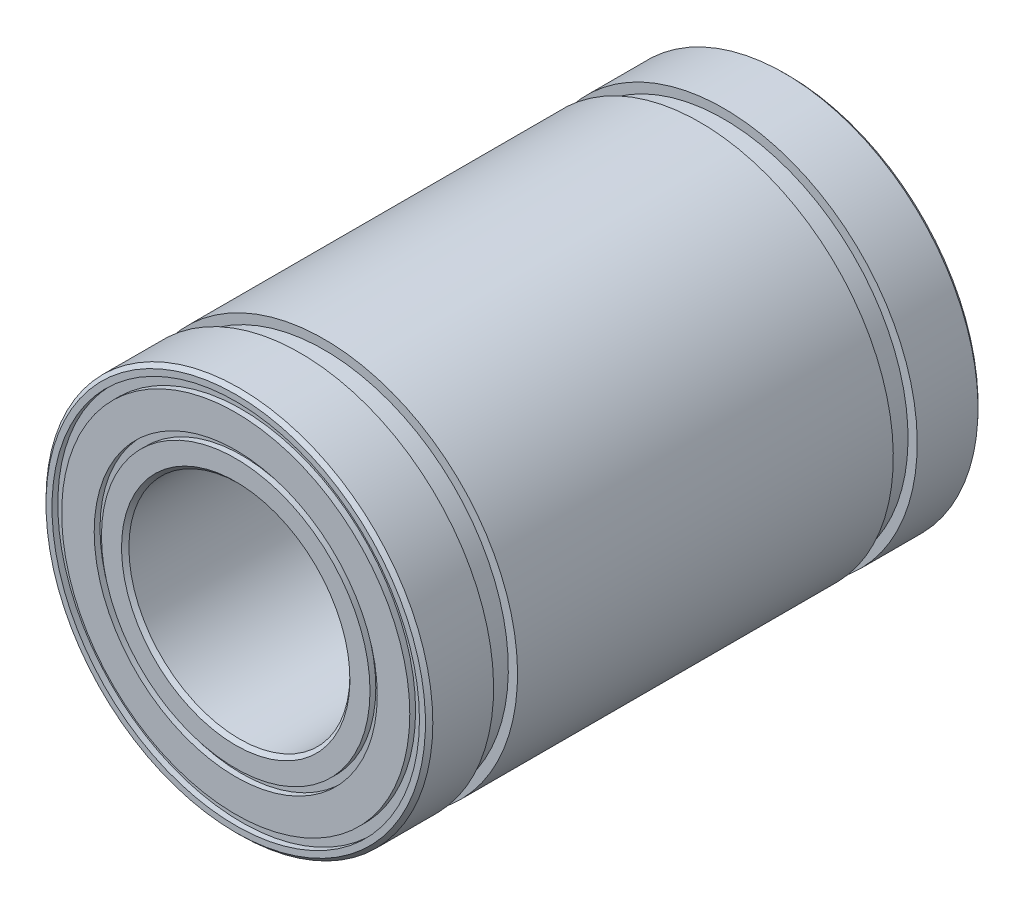
ISO-10303-21;
HEADER;
FILE_DESCRIPTION(('STEP AP214'),'2;1');
FILE_NAME('part.step','',(''),(''),'','','');
FILE_SCHEMA(('AUTOMOTIVE_DESIGN { 1 0 10303 214 1 1 1 1 }'));
ENDSEC;
DATA;
#1=APPLICATION_CONTEXT('core data for automotive mechanical design processes');
#2=APPLICATION_PROTOCOL_DEFINITION('international standard','automotive_design',2000,#1);
#3=PRODUCT_CONTEXT('',#1,'mechanical');
#4=PRODUCT('Part','Part','',(#3));
#5=PRODUCT_RELATED_PRODUCT_CATEGORY('part','',(#4));
#6=PRODUCT_DEFINITION_FORMATION('','',#4);
#7=PRODUCT_DEFINITION_CONTEXT('part definition',#1,'design');
#8=PRODUCT_DEFINITION('design','',#6,#7);
#9=PRODUCT_DEFINITION_SHAPE('','',#8);
#10=(LENGTH_UNIT() NAMED_UNIT(*) SI_UNIT(.MILLI.,.METRE.));
#11=(NAMED_UNIT(*) PLANE_ANGLE_UNIT() SI_UNIT($,.RADIAN.));
#12=(NAMED_UNIT(*) SI_UNIT($,.STERADIAN.) SOLID_ANGLE_UNIT());
#13=UNCERTAINTY_MEASURE_WITH_UNIT(LENGTH_MEASURE(1.E-05),#10,'distance_accuracy_value','');
#14=(GEOMETRIC_REPRESENTATION_CONTEXT(3) GLOBAL_UNCERTAINTY_ASSIGNED_CONTEXT((#13)) GLOBAL_UNIT_ASSIGNED_CONTEXT((#10,
#11,#12)) REPRESENTATION_CONTEXT('',''));
#15=CARTESIAN_POINT('',(0.,0.,0.));
#16=DIRECTION('',(0.,0.,1.));
#17=DIRECTION('',(1.,0.,0.));
#18=AXIS2_PLACEMENT_3D('',#15,#16,#17);
#19=CARTESIAN_POINT('',(0.,0.,15.));
#20=DIRECTION('',(0.,0.,-1.));
#21=DIRECTION('',(0.,1.,0.));
#22=AXIS2_PLACEMENT_3D('',#19,#20,#21);
#23=CYLINDRICAL_SURFACE('',#22,6.);
#24=CARTESIAN_POINT('',(0.,0.,14.7999999999797));
#25=DIRECTION('',(0.,0.,1.));
#26=DIRECTION('',(1.,0.,0.));
#27=AXIS2_PLACEMENT_3D('',#24,#25,#26);
#28=CIRCLE('',#27,6.00000000002865);
#29=CARTESIAN_POINT('',(6.00000000002865,0.,14.7999999999797));
#30=VERTEX_POINT('',#29);
#31=EDGE_CURVE('E30',#30,#30,#28,.T.);
#32=ORIENTED_EDGE('',*,*,#31,.T.);
#33=EDGE_LOOP('',(#32));
#34=FACE_BOUND('',#33,.T.);
#35=CARTESIAN_POINT('',(0.,0.,-14.8000000000366));
#36=DIRECTION('',(0.,0.,-1.));
#37=DIRECTION('',(1.,0.,0.));
#38=AXIS2_PLACEMENT_3D('',#35,#36,#37);
#39=CIRCLE('',#38,5.99999999997181);
#40=CARTESIAN_POINT('',(5.99999999997181,0.,-14.8000000000366));
#41=VERTEX_POINT('',#40);
#42=EDGE_CURVE('E110',#41,#41,#39,.T.);
#43=ORIENTED_EDGE('',*,*,#42,.T.);
#44=EDGE_LOOP('',(#43));
#45=FACE_BOUND('',#44,.T.);
#46=ADVANCED_FACE('F15',(#34,#45),#23,.F.);
#47=CARTESIAN_POINT('',(0.,0.,15.0000000000432));
#48=DIRECTION('',(0.,0.,1.));
#49=DIRECTION('',(0.,-1.,0.));
#50=AXIS2_PLACEMENT_3D('',#47,#48,#49);
#51=CONICAL_SURFACE('',#50,6.20000000009213,0.785398163397448);
#52=ORIENTED_EDGE('',*,*,#31,.F.);
#53=EDGE_LOOP('',(#52));
#54=FACE_BOUND('',#53,.T.);
#55=CARTESIAN_POINT('',(0.,0.,15.0000000000432));
#56=DIRECTION('',(0.,0.,1.));
#57=DIRECTION('',(0.,-1.,0.));
#58=AXIS2_PLACEMENT_3D('',#55,#56,#57);
#59=CIRCLE('',#58,6.20000000009213);
#60=CARTESIAN_POINT('',(0.,-6.20000000009213,15.0000000000432));
#61=VERTEX_POINT('',#60);
#62=EDGE_CURVE('E18',#61,#61,#59,.T.);
#63=ORIENTED_EDGE('',*,*,#62,.T.);
#64=EDGE_LOOP('',(#63));
#65=FACE_BOUND('',#64,.T.);
#66=ADVANCED_FACE('F429',(#54,#65),#51,.F.);
#67=CARTESIAN_POINT('',(0.,0.,-14.9999999999864));
#68=DIRECTION('',(0.,0.,-1.));
#69=DIRECTION('',(-1.,0.,0.));
#70=AXIS2_PLACEMENT_3D('',#67,#68,#69);
#71=CONICAL_SURFACE('',#70,6.1999999999216,0.78539816325534);
#72=CARTESIAN_POINT('',(0.,0.,-15.0000000000432));
#73=DIRECTION('',(0.,0.,-1.));
#74=DIRECTION('',(-1.,0.,0.));
#75=AXIS2_PLACEMENT_3D('',#72,#73,#74);
#76=CIRCLE('',#75,6.19999999997844);
#77=CARTESIAN_POINT('',(-6.19999999997844,0.,-15.0000000000432));
#78=VERTEX_POINT('',#77);
#79=EDGE_CURVE('E105',#78,#78,#76,.T.);
#80=ORIENTED_EDGE('',*,*,#79,.T.);
#81=EDGE_LOOP('',(#80));
#82=FACE_BOUND('',#81,.T.);
#83=ORIENTED_EDGE('',*,*,#42,.F.);
#84=EDGE_LOOP('',(#83));
#85=FACE_BOUND('',#84,.T.);
#86=ADVANCED_FACE('F420',(#82,#85),#71,.F.);
#87=CARTESIAN_POINT('',(0.,6.44999999999999,15.));
#88=DIRECTION('',(0.,0.,-1.));
#89=DIRECTION('',(0.,1.,0.));
#90=AXIS2_PLACEMENT_3D('',#87,#88,#89);
#91=PLANE('',#90);
#92=ORIENTED_EDGE('',*,*,#62,.F.);
#93=EDGE_LOOP('',(#92));
#94=FACE_BOUND('',#93,.T.);
#95=CARTESIAN_POINT('',(0.,0.,15.));
#96=DIRECTION('',(0.,0.,1.));
#97=DIRECTION('',(1.,0.,0.));
#98=AXIS2_PLACEMENT_3D('',#95,#96,#97);
#99=CIRCLE('',#98,7.29);
#100=CARTESIAN_POINT('',(7.29,0.,15.));
#101=VERTEX_POINT('',#100);
#102=EDGE_CURVE('E103',#101,#101,#99,.F.);
#103=ORIENTED_EDGE('',*,*,#102,.F.);
#104=EDGE_LOOP('',(#103));
#105=FACE_BOUND('',#104,.T.);
#106=ADVANCED_FACE('F411',(#94,#105),#91,.F.);
#107=CARTESIAN_POINT('',(0.,10.5,-15.));
#108=DIRECTION('',(0.,0.,1.));
#109=DIRECTION('',(0.,-1.,0.));
#110=AXIS2_PLACEMENT_3D('',#107,#108,#109);
#111=PLANE('',#110);
#112=ORIENTED_EDGE('',*,*,#79,.F.);
#113=EDGE_LOOP('',(#112));
#114=FACE_BOUND('',#113,.T.);
#115=CARTESIAN_POINT('',(0.,0.,-15.));
#116=DIRECTION('',(0.,0.,-1.));
#117=DIRECTION('',(-1.,0.,0.));
#118=AXIS2_PLACEMENT_3D('',#115,#116,#117);
#119=CIRCLE('',#118,7.29);
#120=CARTESIAN_POINT('',(-7.29,0.,-15.));
#121=VERTEX_POINT('',#120);
#122=EDGE_CURVE('E100',#121,#121,#119,.F.);
#123=ORIENTED_EDGE('',*,*,#122,.F.);
#124=EDGE_LOOP('',(#123));
#125=FACE_BOUND('',#124,.T.);
#126=ADVANCED_FACE('F402',(#114,#125),#111,.F.);
#127=CARTESIAN_POINT('',(0.,0.,14.685));
#128=DIRECTION('',(0.,0.,1.));
#129=DIRECTION('',(1.,0.,0.));
#130=AXIS2_PLACEMENT_3D('',#127,#128,#129);
#131=CYLINDRICAL_SURFACE('',#130,7.29);
#132=CARTESIAN_POINT('',(0.,0.,14.685));
#133=DIRECTION('',(0.,0.,1.));
#134=DIRECTION('',(1.,0.,0.));
#135=AXIS2_PLACEMENT_3D('',#132,#133,#134);
#136=CIRCLE('',#135,7.29);
#137=CARTESIAN_POINT('',(7.29,0.,14.685));
#138=VERTEX_POINT('',#137);
#139=EDGE_CURVE('E97',#138,#138,#136,.F.);
#140=ORIENTED_EDGE('',*,*,#139,.F.);
#141=EDGE_LOOP('',(#140));
#142=FACE_BOUND('',#141,.T.);
#143=ORIENTED_EDGE('',*,*,#102,.T.);
#144=EDGE_LOOP('',(#143));
#145=FACE_BOUND('',#144,.T.);
#146=ADVANCED_FACE('F393',(#142,#145),#131,.T.);
#147=CARTESIAN_POINT('',(0.,0.,-14.685));
#148=DIRECTION('',(0.,0.,-1.));
#149=DIRECTION('',(-1.,0.,0.));
#150=AXIS2_PLACEMENT_3D('',#147,#148,#149);
#151=CYLINDRICAL_SURFACE('',#150,7.29);
#152=CARTESIAN_POINT('',(0.,0.,-14.685));
#153=DIRECTION('',(0.,0.,-1.));
#154=DIRECTION('',(-1.,0.,0.));
#155=AXIS2_PLACEMENT_3D('',#152,#153,#154);
#156=CIRCLE('',#155,7.29);
#157=CARTESIAN_POINT('',(-7.29,0.,-14.685));
#158=VERTEX_POINT('',#157);
#159=EDGE_CURVE('E94',#158,#158,#156,.F.);
#160=ORIENTED_EDGE('',*,*,#159,.F.);
#161=EDGE_LOOP('',(#160));
#162=FACE_BOUND('',#161,.T.);
#163=ORIENTED_EDGE('',*,*,#122,.T.);
#164=EDGE_LOOP('',(#163));
#165=FACE_BOUND('',#164,.T.);
#166=ADVANCED_FACE('F383',(#162,#165),#151,.T.);
#167=CARTESIAN_POINT('',(0.,0.,14.685));
#168=DIRECTION('',(0.,0.,1.));
#169=DIRECTION('',(1.,0.,0.));
#170=AXIS2_PLACEMENT_3D('',#167,#168,#169);
#171=PLANE('',#170);
#172=ORIENTED_EDGE('',*,*,#139,.T.);
#173=EDGE_LOOP('',(#172));
#174=FACE_BOUND('',#173,.T.);
#175=CARTESIAN_POINT('',(0.,0.,14.685));
#176=DIRECTION('',(0.,0.,1.));
#177=DIRECTION('',(1.,0.,0.));
#178=AXIS2_PLACEMENT_3D('',#175,#176,#177);
#179=CIRCLE('',#178,7.68375);
#180=CARTESIAN_POINT('',(7.68375,0.,14.685));
#181=VERTEX_POINT('',#180);
#182=EDGE_CURVE('E91',#181,#181,#179,.T.);
#183=ORIENTED_EDGE('',*,*,#182,.T.);
#184=EDGE_LOOP('',(#183));
#185=FACE_BOUND('',#184,.T.);
#186=ADVANCED_FACE('F373',(#174,#185),#171,.T.);
#187=CARTESIAN_POINT('',(0.,0.,-14.685));
#188=DIRECTION('',(0.,0.,-1.));
#189=DIRECTION('',(-1.,0.,0.));
#190=AXIS2_PLACEMENT_3D('',#187,#188,#189);
#191=PLANE('',#190);
#192=ORIENTED_EDGE('',*,*,#159,.T.);
#193=EDGE_LOOP('',(#192));
#194=FACE_BOUND('',#193,.T.);
#195=CARTESIAN_POINT('',(0.,0.,-14.685));
#196=DIRECTION('',(0.,0.,-1.));
#197=DIRECTION('',(-1.,0.,0.));
#198=AXIS2_PLACEMENT_3D('',#195,#196,#197);
#199=CIRCLE('',#198,7.68375);
#200=CARTESIAN_POINT('',(-7.68375,0.,-14.685));
#201=VERTEX_POINT('',#200);
#202=EDGE_CURVE('E88',#201,#201,#199,.T.);
#203=ORIENTED_EDGE('',*,*,#202,.T.);
#204=EDGE_LOOP('',(#203));
#205=FACE_BOUND('',#204,.T.);
#206=ADVANCED_FACE('F363',(#194,#205),#191,.T.);
#207=CARTESIAN_POINT('',(0.,0.,14.685));
#208=DIRECTION('',(0.,0.,1.));
#209=DIRECTION('',(1.,0.,0.));
#210=AXIS2_PLACEMENT_3D('',#207,#208,#209);
#211=CYLINDRICAL_SURFACE('',#210,7.68375);
#212=CARTESIAN_POINT('',(0.,0.,15.));
#213=DIRECTION('',(0.,0.,1.));
#214=DIRECTION('',(1.,0.,0.));
#215=AXIS2_PLACEMENT_3D('',#212,#213,#214);
#216=CIRCLE('',#215,7.68375);
#217=CARTESIAN_POINT('',(7.68375,0.,15.));
#218=VERTEX_POINT('',#217);
#219=EDGE_CURVE('E85',#218,#218,#216,.T.);
#220=ORIENTED_EDGE('',*,*,#219,.T.);
#221=EDGE_LOOP('',(#220));
#222=FACE_BOUND('',#221,.T.);
#223=ORIENTED_EDGE('',*,*,#182,.F.);
#224=EDGE_LOOP('',(#223));
#225=FACE_BOUND('',#224,.T.);
#226=ADVANCED_FACE('F353',(#222,#225),#211,.F.);
#227=CARTESIAN_POINT('',(0.,0.,-14.685));
#228=DIRECTION('',(0.,0.,-1.));
#229=DIRECTION('',(-1.,0.,0.));
#230=AXIS2_PLACEMENT_3D('',#227,#228,#229);
#231=CYLINDRICAL_SURFACE('',#230,7.68375);
#232=CARTESIAN_POINT('',(0.,0.,-15.));
#233=DIRECTION('',(0.,0.,-1.));
#234=DIRECTION('',(-1.,0.,0.));
#235=AXIS2_PLACEMENT_3D('',#232,#233,#234);
#236=CIRCLE('',#235,7.68375);
#237=CARTESIAN_POINT('',(-7.68375,0.,-15.));
#238=VERTEX_POINT('',#237);
#239=EDGE_CURVE('E82',#238,#238,#236,.T.);
#240=ORIENTED_EDGE('',*,*,#239,.T.);
#241=EDGE_LOOP('',(#240));
#242=FACE_BOUND('',#241,.T.);
#243=ORIENTED_EDGE('',*,*,#202,.F.);
#244=EDGE_LOOP('',(#243));
#245=FACE_BOUND('',#244,.T.);
#246=ADVANCED_FACE('F343',(#242,#245),#231,.F.);
#247=CARTESIAN_POINT('',(0.,6.44999999999999,15.));
#248=DIRECTION('',(0.,0.,-1.));
#249=DIRECTION('',(0.,1.,0.));
#250=AXIS2_PLACEMENT_3D('',#247,#248,#249);
#251=PLANE('',#250);
#252=ORIENTED_EDGE('',*,*,#219,.F.);
#253=EDGE_LOOP('',(#252));
#254=FACE_BOUND('',#253,.T.);
#255=CARTESIAN_POINT('',(0.,0.,15.));
#256=DIRECTION('',(0.,0.,1.));
#257=DIRECTION('',(1.,0.,0.));
#258=AXIS2_PLACEMENT_3D('',#255,#256,#257);
#259=CIRCLE('',#258,9.45);
#260=CARTESIAN_POINT('',(9.45,0.,15.));
#261=VERTEX_POINT('',#260);
#262=EDGE_CURVE('E79',#261,#261,#259,.F.);
#263=ORIENTED_EDGE('',*,*,#262,.F.);
#264=EDGE_LOOP('',(#263));
#265=FACE_BOUND('',#264,.T.);
#266=ADVANCED_FACE('F333',(#254,#265),#251,.F.);
#267=CARTESIAN_POINT('',(0.,10.5,-15.));
#268=DIRECTION('',(0.,0.,1.));
#269=DIRECTION('',(0.,-1.,0.));
#270=AXIS2_PLACEMENT_3D('',#267,#268,#269);
#271=PLANE('',#270);
#272=ORIENTED_EDGE('',*,*,#239,.F.);
#273=EDGE_LOOP('',(#272));
#274=FACE_BOUND('',#273,.T.);
#275=CARTESIAN_POINT('',(0.,0.,-15.));
#276=DIRECTION('',(0.,0.,-1.));
#277=DIRECTION('',(-1.,0.,0.));
#278=AXIS2_PLACEMENT_3D('',#275,#276,#277);
#279=CIRCLE('',#278,9.45);
#280=CARTESIAN_POINT('',(-9.45,0.,-15.));
#281=VERTEX_POINT('',#280);
#282=EDGE_CURVE('E76',#281,#281,#279,.F.);
#283=ORIENTED_EDGE('',*,*,#282,.F.);
#284=EDGE_LOOP('',(#283));
#285=FACE_BOUND('',#284,.T.);
#286=ADVANCED_FACE('F323',(#274,#285),#271,.F.);
#287=CARTESIAN_POINT('',(0.,0.,14.685));
#288=DIRECTION('',(0.,0.,1.));
#289=DIRECTION('',(1.,0.,0.));
#290=AXIS2_PLACEMENT_3D('',#287,#288,#289);
#291=CYLINDRICAL_SURFACE('',#290,9.45);
#292=CARTESIAN_POINT('',(0.,0.,14.685));
#293=DIRECTION('',(0.,0.,1.));
#294=DIRECTION('',(1.,0.,0.));
#295=AXIS2_PLACEMENT_3D('',#292,#293,#294);
#296=CIRCLE('',#295,9.45);
#297=CARTESIAN_POINT('',(9.45,0.,14.685));
#298=VERTEX_POINT('',#297);
#299=EDGE_CURVE('E73',#298,#298,#296,.F.);
#300=ORIENTED_EDGE('',*,*,#299,.F.);
#301=EDGE_LOOP('',(#300));
#302=FACE_BOUND('',#301,.T.);
#303=ORIENTED_EDGE('',*,*,#262,.T.);
#304=EDGE_LOOP('',(#303));
#305=FACE_BOUND('',#304,.T.);
#306=ADVANCED_FACE('F313',(#302,#305),#291,.T.);
#307=CARTESIAN_POINT('',(0.,0.,-14.685));
#308=DIRECTION('',(0.,0.,-1.));
#309=DIRECTION('',(-1.,0.,0.));
#310=AXIS2_PLACEMENT_3D('',#307,#308,#309);
#311=CYLINDRICAL_SURFACE('',#310,9.45);
#312=CARTESIAN_POINT('',(0.,0.,-14.685));
#313=DIRECTION('',(0.,0.,-1.));
#314=DIRECTION('',(-1.,0.,0.));
#315=AXIS2_PLACEMENT_3D('',#312,#313,#314);
#316=CIRCLE('',#315,9.45);
#317=CARTESIAN_POINT('',(-9.45,0.,-14.685));
#318=VERTEX_POINT('',#317);
#319=EDGE_CURVE('E70',#318,#318,#316,.F.);
#320=ORIENTED_EDGE('',*,*,#319,.F.);
#321=EDGE_LOOP('',(#320));
#322=FACE_BOUND('',#321,.T.);
#323=ORIENTED_EDGE('',*,*,#282,.T.);
#324=EDGE_LOOP('',(#323));
#325=FACE_BOUND('',#324,.T.);
#326=ADVANCED_FACE('F303',(#322,#325),#311,.T.);
#327=CARTESIAN_POINT('',(0.,0.,14.685));
#328=DIRECTION('',(0.,0.,1.));
#329=DIRECTION('',(1.,0.,0.));
#330=AXIS2_PLACEMENT_3D('',#327,#328,#329);
#331=PLANE('',#330);
#332=ORIENTED_EDGE('',*,*,#299,.T.);
#333=EDGE_LOOP('',(#332));
#334=FACE_BOUND('',#333,.T.);
#335=CARTESIAN_POINT('',(0.,0.,14.685));
#336=DIRECTION('',(0.,0.,1.));
#337=DIRECTION('',(1.,0.,0.));
#338=AXIS2_PLACEMENT_3D('',#335,#336,#337);
#339=CIRCLE('',#338,9.975);
#340=CARTESIAN_POINT('',(9.975,0.,14.685));
#341=VERTEX_POINT('',#340);
#342=EDGE_CURVE('E67',#341,#341,#339,.T.);
#343=ORIENTED_EDGE('',*,*,#342,.T.);
#344=EDGE_LOOP('',(#343));
#345=FACE_BOUND('',#344,.T.);
#346=ADVANCED_FACE('F294',(#334,#345),#331,.T.);
#347=CARTESIAN_POINT('',(0.,0.,-14.685));
#348=DIRECTION('',(0.,0.,-1.));
#349=DIRECTION('',(-1.,0.,0.));
#350=AXIS2_PLACEMENT_3D('',#347,#348,#349);
#351=PLANE('',#350);
#352=ORIENTED_EDGE('',*,*,#319,.T.);
#353=EDGE_LOOP('',(#352));
#354=FACE_BOUND('',#353,.T.);
#355=CARTESIAN_POINT('',(0.,0.,-14.685));
#356=DIRECTION('',(0.,0.,-1.));
#357=DIRECTION('',(-1.,0.,0.));
#358=AXIS2_PLACEMENT_3D('',#355,#356,#357);
#359=CIRCLE('',#358,9.975);
#360=CARTESIAN_POINT('',(-9.975,0.,-14.685));
#361=VERTEX_POINT('',#360);
#362=EDGE_CURVE('E64',#361,#361,#359,.T.);
#363=ORIENTED_EDGE('',*,*,#362,.T.);
#364=EDGE_LOOP('',(#363));
#365=FACE_BOUND('',#364,.T.);
#366=ADVANCED_FACE('F285',(#354,#365),#351,.T.);
#367=CARTESIAN_POINT('',(0.,0.,14.685));
#368=DIRECTION('',(0.,0.,1.));
#369=DIRECTION('',(1.,0.,0.));
#370=AXIS2_PLACEMENT_3D('',#367,#368,#369);
#371=CYLINDRICAL_SURFACE('',#370,9.975);
#372=CARTESIAN_POINT('',(0.,0.,15.));
#373=DIRECTION('',(0.,0.,1.));
#374=DIRECTION('',(1.,0.,0.));
#375=AXIS2_PLACEMENT_3D('',#372,#373,#374);
#376=CIRCLE('',#375,9.975);
#377=CARTESIAN_POINT('',(9.975,0.,15.));
#378=VERTEX_POINT('',#377);
#379=EDGE_CURVE('E61',#378,#378,#376,.T.);
#380=ORIENTED_EDGE('',*,*,#379,.T.);
#381=EDGE_LOOP('',(#380));
#382=FACE_BOUND('',#381,.T.);
#383=ORIENTED_EDGE('',*,*,#342,.F.);
#384=EDGE_LOOP('',(#383));
#385=FACE_BOUND('',#384,.T.);
#386=ADVANCED_FACE('F276',(#382,#385),#371,.F.);
#387=CARTESIAN_POINT('',(0.,0.,-14.685));
#388=DIRECTION('',(0.,0.,-1.));
#389=DIRECTION('',(-1.,0.,0.));
#390=AXIS2_PLACEMENT_3D('',#387,#388,#389);
#391=CYLINDRICAL_SURFACE('',#390,9.975);
#392=CARTESIAN_POINT('',(0.,0.,-15.));
#393=DIRECTION('',(0.,0.,-1.));
#394=DIRECTION('',(-1.,0.,0.));
#395=AXIS2_PLACEMENT_3D('',#392,#393,#394);
#396=CIRCLE('',#395,9.975);
#397=CARTESIAN_POINT('',(-9.975,0.,-15.));
#398=VERTEX_POINT('',#397);
#399=EDGE_CURVE('E58',#398,#398,#396,.T.);
#400=ORIENTED_EDGE('',*,*,#399,.T.);
#401=EDGE_LOOP('',(#400));
#402=FACE_BOUND('',#401,.T.);
#403=ORIENTED_EDGE('',*,*,#362,.F.);
#404=EDGE_LOOP('',(#403));
#405=FACE_BOUND('',#404,.T.);
#406=ADVANCED_FACE('F267',(#402,#405),#391,.F.);
#407=CARTESIAN_POINT('',(0.,6.44999999999999,15.));
#408=DIRECTION('',(0.,0.,-1.));
#409=DIRECTION('',(0.,1.,0.));
#410=AXIS2_PLACEMENT_3D('',#407,#408,#409);
#411=PLANE('',#410);
#412=ORIENTED_EDGE('',*,*,#379,.F.);
#413=EDGE_LOOP('',(#412));
#414=FACE_BOUND('',#413,.T.);
#415=CARTESIAN_POINT('',(0.,0.,15.));
#416=DIRECTION('',(0.,0.,-1.));
#417=DIRECTION('',(0.,1.,0.));
#418=AXIS2_PLACEMENT_3D('',#415,#416,#417);
#419=CIRCLE('',#418,10.3);
#420=CARTESIAN_POINT('',(0.,10.3,15.));
#421=VERTEX_POINT('',#420);
#422=EDGE_CURVE('E55',#421,#421,#419,.T.);
#423=ORIENTED_EDGE('',*,*,#422,.F.);
#424=EDGE_LOOP('',(#423));
#425=FACE_BOUND('',#424,.T.);
#426=ADVANCED_FACE('F258',(#414,#425),#411,.F.);
#427=CARTESIAN_POINT('',(0.,10.5,-15.));
#428=DIRECTION('',(0.,0.,1.));
#429=DIRECTION('',(0.,-1.,0.));
#430=AXIS2_PLACEMENT_3D('',#427,#428,#429);
#431=PLANE('',#430);
#432=ORIENTED_EDGE('',*,*,#399,.F.);
#433=EDGE_LOOP('',(#432));
#434=FACE_BOUND('',#433,.T.);
#435=CARTESIAN_POINT('',(0.,0.,-15.));
#436=DIRECTION('',(0.,0.,1.));
#437=DIRECTION('',(0.,-1.,0.));
#438=AXIS2_PLACEMENT_3D('',#435,#436,#437);
#439=CIRCLE('',#438,10.3);
#440=CARTESIAN_POINT('',(0.,-10.3,-15.));
#441=VERTEX_POINT('',#440);
#442=EDGE_CURVE('E51',#441,#441,#439,.T.);
#443=ORIENTED_EDGE('',*,*,#442,.F.);
#444=EDGE_LOOP('',(#443));
#445=FACE_BOUND('',#444,.T.);
#446=ADVANCED_FACE('F143',(#434,#445),#431,.F.);
#447=CARTESIAN_POINT('',(0.,0.,14.8));
#448=DIRECTION('',(0.,0.,-1.));
#449=DIRECTION('',(0.,1.,0.));
#450=AXIS2_PLACEMENT_3D('',#447,#448,#449);
#451=CONICAL_SURFACE('',#450,10.5,0.785398163397453);
#452=CARTESIAN_POINT('',(0.,0.,14.8));
#453=DIRECTION('',(0.,0.,1.));
#454=DIRECTION('',(0.,-1.,0.));
#455=AXIS2_PLACEMENT_3D('',#452,#453,#454);
#456=CIRCLE('',#455,10.5);
#457=CARTESIAN_POINT('',(0.,-10.5,14.8));
#458=VERTEX_POINT('',#457);
#459=EDGE_CURVE('E54',#458,#458,#456,.F.);
#460=ORIENTED_EDGE('',*,*,#459,.F.);
#461=EDGE_LOOP('',(#460));
#462=FACE_BOUND('',#461,.T.);
#463=ORIENTED_EDGE('',*,*,#422,.T.);
#464=EDGE_LOOP('',(#463));
#465=FACE_BOUND('',#464,.T.);
#466=ADVANCED_FACE('F133',(#462,#465),#451,.T.);
#467=CARTESIAN_POINT('',(0.,0.,-14.8));
#468=DIRECTION('',(0.,0.,1.));
#469=DIRECTION('',(0.,-1.,0.));
#470=AXIS2_PLACEMENT_3D('',#467,#468,#469);
#471=CONICAL_SURFACE('',#470,10.5,0.785398163397435);
#472=ORIENTED_EDGE('',*,*,#442,.T.);
#473=EDGE_LOOP('',(#472));
#474=FACE_BOUND('',#473,.T.);
#475=CARTESIAN_POINT('',(0.,0.,-14.8));
#476=DIRECTION('',(0.,0.,1.));
#477=DIRECTION('',(0.,-1.,0.));
#478=AXIS2_PLACEMENT_3D('',#475,#476,#477);
#479=CIRCLE('',#478,10.5);
#480=CARTESIAN_POINT('',(0.,-10.5,-14.8));
#481=VERTEX_POINT('',#480);
#482=EDGE_CURVE('E50',#481,#481,#479,.T.);
#483=ORIENTED_EDGE('',*,*,#482,.F.);
#484=EDGE_LOOP('',(#483));
#485=FACE_BOUND('',#484,.T.);
#486=ADVANCED_FACE('F130',(#474,#485),#471,.T.);
#487=CARTESIAN_POINT('',(0.,0.,15.));
#488=DIRECTION('',(0.,0.,1.));
#489=DIRECTION('',(0.,-1.,0.));
#490=AXIS2_PLACEMENT_3D('',#487,#488,#489);
#491=CYLINDRICAL_SURFACE('',#490,10.5);
#492=CARTESIAN_POINT('',(0.,0.,11.5));
#493=DIRECTION('',(0.,0.,1.));
#494=DIRECTION('',(0.,-1.,0.));
#495=AXIS2_PLACEMENT_3D('',#492,#493,#494);
#496=CIRCLE('',#495,10.5);
#497=CARTESIAN_POINT('',(0.,-10.5,11.5));
#498=VERTEX_POINT('',#497);
#499=EDGE_CURVE('E47',#498,#498,#496,.T.);
#500=ORIENTED_EDGE('',*,*,#499,.T.);
#501=EDGE_LOOP('',(#500));
#502=FACE_BOUND('',#501,.T.);
#503=ORIENTED_EDGE('',*,*,#459,.T.);
#504=EDGE_LOOP('',(#503));
#505=FACE_BOUND('',#504,.T.);
#506=ADVANCED_FACE('F132',(#502,#505),#491,.T.);
#507=CARTESIAN_POINT('',(0.,0.,15.));
#508=DIRECTION('',(0.,0.,1.));
#509=DIRECTION('',(0.,-1.,0.));
#510=AXIS2_PLACEMENT_3D('',#507,#508,#509);
#511=CYLINDRICAL_SURFACE('',#510,10.5);
#512=ORIENTED_EDGE('',*,*,#482,.T.);
#513=EDGE_LOOP('',(#512));
#514=FACE_BOUND('',#513,.T.);
#515=CARTESIAN_POINT('',(0.,0.,-11.5));
#516=DIRECTION('',(0.,0.,1.));
#517=DIRECTION('',(0.,-1.,0.));
#518=AXIS2_PLACEMENT_3D('',#515,#516,#517);
#519=CIRCLE('',#518,10.5);
#520=CARTESIAN_POINT('',(0.,-10.5,-11.5));
#521=VERTEX_POINT('',#520);
#522=EDGE_CURVE('E44',#521,#521,#519,.F.);
#523=ORIENTED_EDGE('',*,*,#522,.T.);
#524=EDGE_LOOP('',(#523));
#525=FACE_BOUND('',#524,.T.);
#526=ADVANCED_FACE('F127',(#514,#525),#511,.T.);
#527=CARTESIAN_POINT('',(0.,10.5,11.5));
#528=DIRECTION('',(0.,0.,1.));
#529=DIRECTION('',(0.,-1.,0.));
#530=AXIS2_PLACEMENT_3D('',#527,#528,#529);
#531=PLANE('',#530);
#532=CARTESIAN_POINT('',(0.,0.,11.5));
#533=DIRECTION('',(0.,0.,1.));
#534=DIRECTION('',(0.,-1.,0.));
#535=AXIS2_PLACEMENT_3D('',#532,#533,#534);
#536=CIRCLE('',#535,10.);
#537=CARTESIAN_POINT('',(0.,-10.,11.5));
#538=VERTEX_POINT('',#537);
#539=EDGE_CURVE('E41',#538,#538,#536,.F.);
#540=ORIENTED_EDGE('',*,*,#539,.F.);
#541=EDGE_LOOP('',(#540));
#542=FACE_BOUND('',#541,.T.);
#543=ORIENTED_EDGE('',*,*,#499,.F.);
#544=EDGE_LOOP('',(#543));
#545=FACE_BOUND('',#544,.T.);
#546=ADVANCED_FACE('F172',(#542,#545),#531,.F.);
#547=CARTESIAN_POINT('',(0.,9.99999999999999,-11.5));
#548=DIRECTION('',(0.,0.,-1.));
#549=DIRECTION('',(0.,1.,0.));
#550=AXIS2_PLACEMENT_3D('',#547,#548,#549);
#551=PLANE('',#550);
#552=CARTESIAN_POINT('',(0.,0.,-11.5));
#553=DIRECTION('',(0.,0.,1.));
#554=DIRECTION('',(0.,-1.,0.));
#555=AXIS2_PLACEMENT_3D('',#552,#553,#554);
#556=CIRCLE('',#555,10.);
#557=CARTESIAN_POINT('',(0.,-10.,-11.5));
#558=VERTEX_POINT('',#557);
#559=EDGE_CURVE('E38',#558,#558,#556,.T.);
#560=ORIENTED_EDGE('',*,*,#559,.F.);
#561=EDGE_LOOP('',(#560));
#562=FACE_BOUND('',#561,.T.);
#563=ORIENTED_EDGE('',*,*,#522,.F.);
#564=EDGE_LOOP('',(#563));
#565=FACE_BOUND('',#564,.T.);
#566=ADVANCED_FACE('F168',(#562,#565),#551,.F.);
#567=CARTESIAN_POINT('',(0.,0.,15.));
#568=DIRECTION('',(0.,0.,1.));
#569=DIRECTION('',(0.,-1.,0.));
#570=AXIS2_PLACEMENT_3D('',#567,#568,#569);
#571=CYLINDRICAL_SURFACE('',#570,10.);
#572=CARTESIAN_POINT('',(0.,0.,10.2));
#573=DIRECTION('',(0.,0.,1.));
#574=DIRECTION('',(0.,-1.,0.));
#575=AXIS2_PLACEMENT_3D('',#572,#573,#574);
#576=CIRCLE('',#575,10.);
#577=CARTESIAN_POINT('',(0.,-10.,10.2));
#578=VERTEX_POINT('',#577);
#579=EDGE_CURVE('E35',#578,#578,#576,.T.);
#580=ORIENTED_EDGE('',*,*,#579,.T.);
#581=EDGE_LOOP('',(#580));
#582=FACE_BOUND('',#581,.T.);
#583=ORIENTED_EDGE('',*,*,#539,.T.);
#584=EDGE_LOOP('',(#583));
#585=FACE_BOUND('',#584,.T.);
#586=ADVANCED_FACE('F164',(#582,#585),#571,.T.);
#587=CARTESIAN_POINT('',(0.,0.,15.));
#588=DIRECTION('',(0.,0.,1.));
#589=DIRECTION('',(0.,-1.,0.));
#590=AXIS2_PLACEMENT_3D('',#587,#588,#589);
#591=CYLINDRICAL_SURFACE('',#590,10.);
#592=ORIENTED_EDGE('',*,*,#559,.T.);
#593=EDGE_LOOP('',(#592));
#594=FACE_BOUND('',#593,.T.);
#595=CARTESIAN_POINT('',(0.,0.,-10.2));
#596=DIRECTION('',(0.,0.,1.));
#597=DIRECTION('',(0.,-1.,0.));
#598=AXIS2_PLACEMENT_3D('',#595,#596,#597);
#599=CIRCLE('',#598,10.);
#600=CARTESIAN_POINT('',(0.,-10.,-10.2));
#601=VERTEX_POINT('',#600);
#602=EDGE_CURVE('E27',#601,#601,#599,.F.);
#603=ORIENTED_EDGE('',*,*,#602,.T.);
#604=EDGE_LOOP('',(#603));
#605=FACE_BOUND('',#604,.T.);
#606=ADVANCED_FACE('F160',(#594,#605),#591,.T.);
#607=CARTESIAN_POINT('',(0.,9.99999999999999,10.2));
#608=DIRECTION('',(0.,0.,-1.));
#609=DIRECTION('',(0.,1.,0.));
#610=AXIS2_PLACEMENT_3D('',#607,#608,#609);
#611=PLANE('',#610);
#612=ORIENTED_EDGE('',*,*,#579,.F.);
#613=EDGE_LOOP('',(#612));
#614=FACE_BOUND('',#613,.T.);
#615=CARTESIAN_POINT('',(0.,0.,10.2));
#616=DIRECTION('',(0.,0.,1.));
#617=DIRECTION('',(0.,-1.,0.));
#618=AXIS2_PLACEMENT_3D('',#615,#616,#617);
#619=CIRCLE('',#618,10.5);
#620=CARTESIAN_POINT('',(0.,-10.5,10.2));
#621=VERTEX_POINT('',#620);
#622=EDGE_CURVE('E22',#621,#621,#619,.F.);
#623=ORIENTED_EDGE('',*,*,#622,.F.);
#624=EDGE_LOOP('',(#623));
#625=FACE_BOUND('',#624,.T.);
#626=ADVANCED_FACE('F153',(#614,#625),#611,.F.);
#627=CARTESIAN_POINT('',(0.,10.5,-10.2));
#628=DIRECTION('',(0.,0.,1.));
#629=DIRECTION('',(0.,-1.,0.));
#630=AXIS2_PLACEMENT_3D('',#627,#628,#629);
#631=PLANE('',#630);
#632=ORIENTED_EDGE('',*,*,#602,.F.);
#633=EDGE_LOOP('',(#632));
#634=FACE_BOUND('',#633,.T.);
#635=CARTESIAN_POINT('',(0.,0.,-10.2));
#636=DIRECTION('',(0.,0.,1.));
#637=DIRECTION('',(0.,-1.,0.));
#638=AXIS2_PLACEMENT_3D('',#635,#636,#637);
#639=CIRCLE('',#638,10.5);
#640=CARTESIAN_POINT('',(0.,-10.5,-10.2));
#641=VERTEX_POINT('',#640);
#642=EDGE_CURVE('E10',#641,#641,#639,.T.);
#643=ORIENTED_EDGE('',*,*,#642,.F.);
#644=EDGE_LOOP('',(#643));
#645=FACE_BOUND('',#644,.T.);
#646=ADVANCED_FACE('F148',(#634,#645),#631,.F.);
#647=CARTESIAN_POINT('',(0.,0.,15.));
#648=DIRECTION('',(0.,0.,1.));
#649=DIRECTION('',(0.,-1.,0.));
#650=AXIS2_PLACEMENT_3D('',#647,#648,#649);
#651=CYLINDRICAL_SURFACE('',#650,10.5);
#652=ORIENTED_EDGE('',*,*,#642,.T.);
#653=EDGE_LOOP('',(#652));
#654=FACE_BOUND('',#653,.T.);
#655=ORIENTED_EDGE('',*,*,#622,.T.);
#656=EDGE_LOOP('',(#655));
#657=FACE_BOUND('',#656,.T.);
#658=ADVANCED_FACE('F146',(#654,#657),#651,.T.);
#659=CLOSED_SHELL('',(#46,#66,#86,#106,#126,#146,#166,#186,#206,#226,#246,#266,#286,#306,#326,
#346,#366,#386,#406,#426,#446,#466,#486,#506,#526,#546,#566,#586,#606,#626,#646,#658));
#660=MANIFOLD_SOLID_BREP('B1',#659);
#661=ADVANCED_BREP_SHAPE_REPRESENTATION('',(#18,#660),#14);
#662=SHAPE_DEFINITION_REPRESENTATION(#9,#661);
ENDSEC;
END-ISO-10303-21;
